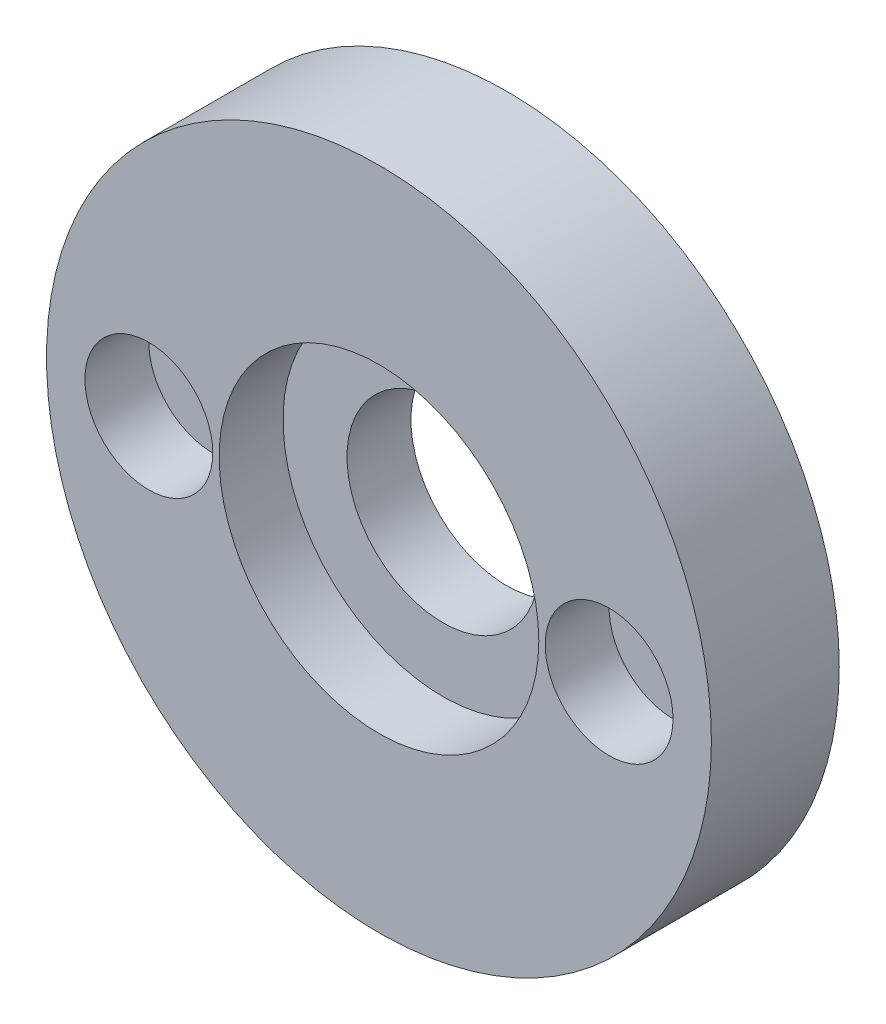
ISO-10303-21;
HEADER;
FILE_DESCRIPTION(('STEP AP214'),'2;1');
FILE_NAME('part.step','',(''),(''),'','','');
FILE_SCHEMA(('AUTOMOTIVE_DESIGN { 1 0 10303 214 1 1 1 1 }'));
ENDSEC;
DATA;
#1=APPLICATION_CONTEXT('core data for automotive mechanical design processes');
#2=APPLICATION_PROTOCOL_DEFINITION('international standard','automotive_design',2000,#1);
#3=PRODUCT_CONTEXT('',#1,'mechanical');
#4=PRODUCT('Part','Part','',(#3));
#5=PRODUCT_RELATED_PRODUCT_CATEGORY('part','',(#4));
#6=PRODUCT_DEFINITION_FORMATION('','',#4);
#7=PRODUCT_DEFINITION_CONTEXT('part definition',#1,'design');
#8=PRODUCT_DEFINITION('design','',#6,#7);
#9=PRODUCT_DEFINITION_SHAPE('','',#8);
#10=(LENGTH_UNIT() NAMED_UNIT(*) SI_UNIT(.MILLI.,.METRE.));
#11=(NAMED_UNIT(*) PLANE_ANGLE_UNIT() SI_UNIT($,.RADIAN.));
#12=(NAMED_UNIT(*) SI_UNIT($,.STERADIAN.) SOLID_ANGLE_UNIT());
#13=UNCERTAINTY_MEASURE_WITH_UNIT(LENGTH_MEASURE(1.E-05),#10,'distance_accuracy_value','');
#14=(GEOMETRIC_REPRESENTATION_CONTEXT(3) GLOBAL_UNCERTAINTY_ASSIGNED_CONTEXT((#13)) GLOBAL_UNIT_ASSIGNED_CONTEXT((#10,
#11,#12)) REPRESENTATION_CONTEXT('',''));
#15=CARTESIAN_POINT('',(0.,0.,0.));
#16=DIRECTION('',(0.,0.,1.));
#17=DIRECTION('',(1.,0.,0.));
#18=AXIS2_PLACEMENT_3D('',#15,#16,#17);
#19=CARTESIAN_POINT('',(0.,0.,10.));
#20=DIRECTION('',(0.,0.,-1.));
#21=DIRECTION('',(-1.,0.,0.));
#22=AXIS2_PLACEMENT_3D('',#19,#20,#21);
#23=CYLINDRICAL_SURFACE('',#22,7.5);
#24=CARTESIAN_POINT('',(0.,0.,0.));
#25=DIRECTION('',(0.,0.,1.));
#26=DIRECTION('',(1.,0.,0.));
#27=AXIS2_PLACEMENT_3D('',#24,#25,#26);
#28=CIRCLE('',#27,7.5);
#29=CARTESIAN_POINT('',(7.5,0.,0.));
#30=VERTEX_POINT('',#29);
#31=EDGE_CURVE('E47',#30,#30,#28,.T.);
#32=ORIENTED_EDGE('',*,*,#31,.F.);
#33=EDGE_LOOP('',(#32));
#34=FACE_BOUND('',#33,.T.);
#35=CARTESIAN_POINT('',(0.,0.,5.));
#36=DIRECTION('',(0.,0.,1.));
#37=DIRECTION('',(1.,0.,0.));
#38=AXIS2_PLACEMENT_3D('',#35,#36,#37);
#39=CIRCLE('',#38,7.5);
#40=CARTESIAN_POINT('',(7.5,0.,5.));
#41=VERTEX_POINT('',#40);
#42=EDGE_CURVE('E36',#41,#41,#39,.T.);
#43=ORIENTED_EDGE('',*,*,#42,.T.);
#44=EDGE_LOOP('',(#43));
#45=FACE_BOUND('',#44,.T.);
#46=ADVANCED_FACE('F32',(#34,#45),#23,.F.);
#47=CARTESIAN_POINT('',(-18.,0.,10.));
#48=DIRECTION('',(0.,0.,-1.));
#49=DIRECTION('',(-1.,0.,0.));
#50=AXIS2_PLACEMENT_3D('',#47,#48,#49);
#51=CYLINDRICAL_SURFACE('',#50,5.);
#52=CARTESIAN_POINT('',(-18.,0.,5.));
#53=DIRECTION('',(0.,0.,1.));
#54=DIRECTION('',(1.,0.,0.));
#55=AXIS2_PLACEMENT_3D('',#52,#53,#54);
#56=CIRCLE('',#55,5.);
#57=CARTESIAN_POINT('',(-13.,0.,5.));
#58=VERTEX_POINT('',#57);
#59=EDGE_CURVE('E10',#58,#58,#56,.T.);
#60=ORIENTED_EDGE('',*,*,#59,.F.);
#61=EDGE_LOOP('',(#60));
#62=FACE_BOUND('',#61,.T.);
#63=CARTESIAN_POINT('',(-18.,0.,10.));
#64=DIRECTION('',(0.,0.,1.));
#65=DIRECTION('',(1.,0.,0.));
#66=AXIS2_PLACEMENT_3D('',#63,#64,#65);
#67=CIRCLE('',#66,5.);
#68=CARTESIAN_POINT('',(-13.,0.,10.));
#69=VERTEX_POINT('',#68);
#70=EDGE_CURVE('E44',#69,#69,#67,.T.);
#71=ORIENTED_EDGE('',*,*,#70,.T.);
#72=EDGE_LOOP('',(#71));
#73=FACE_BOUND('',#72,.T.);
#74=ADVANCED_FACE('F95',(#62,#73),#51,.F.);
#75=CARTESIAN_POINT('',(0.,0.,10.));
#76=DIRECTION('',(0.,0.,-1.));
#77=DIRECTION('',(-1.,0.,0.));
#78=AXIS2_PLACEMENT_3D('',#75,#76,#77);
#79=CYLINDRICAL_SURFACE('',#78,26.);
#80=CARTESIAN_POINT('',(0.,0.,10.));
#81=DIRECTION('',(0.,0.,1.));
#82=DIRECTION('',(1.,0.,0.));
#83=AXIS2_PLACEMENT_3D('',#80,#81,#82);
#84=CIRCLE('',#83,26.);
#85=CARTESIAN_POINT('',(26.,0.,10.));
#86=VERTEX_POINT('',#85);
#87=EDGE_CURVE('E50',#86,#86,#84,.T.);
#88=ORIENTED_EDGE('',*,*,#87,.F.);
#89=EDGE_LOOP('',(#88));
#90=FACE_BOUND('',#89,.T.);
#91=CARTESIAN_POINT('',(0.,0.,0.));
#92=DIRECTION('',(0.,0.,1.));
#93=DIRECTION('',(1.,0.,0.));
#94=AXIS2_PLACEMENT_3D('',#91,#92,#93);
#95=CIRCLE('',#94,26.);
#96=CARTESIAN_POINT('',(26.,0.,0.));
#97=VERTEX_POINT('',#96);
#98=EDGE_CURVE('E51',#97,#97,#95,.T.);
#99=ORIENTED_EDGE('',*,*,#98,.T.);
#100=EDGE_LOOP('',(#99));
#101=FACE_BOUND('',#100,.T.);
#102=ADVANCED_FACE('F34',(#90,#101),#79,.T.);
#103=CARTESIAN_POINT('',(18.,0.,10.));
#104=DIRECTION('',(0.,0.,-1.));
#105=DIRECTION('',(-1.,0.,0.));
#106=AXIS2_PLACEMENT_3D('',#103,#104,#105);
#107=CYLINDRICAL_SURFACE('',#106,5.);
#108=CARTESIAN_POINT('',(18.,0.,5.));
#109=DIRECTION('',(0.,0.,1.));
#110=DIRECTION('',(1.,0.,0.));
#111=AXIS2_PLACEMENT_3D('',#108,#109,#110);
#112=CIRCLE('',#111,5.);
#113=CARTESIAN_POINT('',(23.,0.,5.));
#114=VERTEX_POINT('',#113);
#115=EDGE_CURVE('E68',#114,#114,#112,.F.);
#116=ORIENTED_EDGE('',*,*,#115,.T.);
#117=EDGE_LOOP('',(#116));
#118=FACE_BOUND('',#117,.T.);
#119=CARTESIAN_POINT('',(18.,0.,10.));
#120=DIRECTION('',(0.,0.,1.));
#121=DIRECTION('',(1.,0.,0.));
#122=AXIS2_PLACEMENT_3D('',#119,#120,#121);
#123=CIRCLE('',#122,5.);
#124=CARTESIAN_POINT('',(23.,0.,10.));
#125=VERTEX_POINT('',#124);
#126=EDGE_CURVE('E40',#125,#125,#123,.F.);
#127=ORIENTED_EDGE('',*,*,#126,.F.);
#128=EDGE_LOOP('',(#127));
#129=FACE_BOUND('',#128,.T.);
#130=ADVANCED_FACE('F104',(#118,#129),#107,.F.);
#131=CARTESIAN_POINT('',(0.,0.,10.));
#132=DIRECTION('',(0.,0.,1.));
#133=DIRECTION('',(1.,0.,0.));
#134=AXIS2_PLACEMENT_3D('',#131,#132,#133);
#135=PLANE('',#134);
#136=CARTESIAN_POINT('',(0.,0.,10.));
#137=DIRECTION('',(0.,0.,1.));
#138=DIRECTION('',(1.,0.,0.));
#139=AXIS2_PLACEMENT_3D('',#136,#137,#138);
#140=CIRCLE('',#139,12.5);
#141=CARTESIAN_POINT('',(12.5,0.,10.));
#142=VERTEX_POINT('',#141);
#143=EDGE_CURVE('E73',#142,#142,#140,.T.);
#144=ORIENTED_EDGE('',*,*,#143,.F.);
#145=EDGE_LOOP('',(#144));
#146=FACE_BOUND('',#145,.T.);
#147=ORIENTED_EDGE('',*,*,#87,.T.);
#148=EDGE_LOOP('',(#147));
#149=FACE_BOUND('',#148,.T.);
#150=ORIENTED_EDGE('',*,*,#70,.F.);
#151=EDGE_LOOP('',(#150));
#152=FACE_BOUND('',#151,.T.);
#153=ORIENTED_EDGE('',*,*,#126,.T.);
#154=EDGE_LOOP('',(#153));
#155=FACE_BOUND('',#154,.T.);
#156=ADVANCED_FACE('F107',(#146,#149,#152,#155),#135,.T.);
#157=CARTESIAN_POINT('',(0.,0.,0.));
#158=DIRECTION('',(0.,0.,1.));
#159=DIRECTION('',(1.,0.,0.));
#160=AXIS2_PLACEMENT_3D('',#157,#158,#159);
#161=PLANE('',#160);
#162=ORIENTED_EDGE('',*,*,#98,.F.);
#163=EDGE_LOOP('',(#162));
#164=FACE_BOUND('',#163,.T.);
#165=ORIENTED_EDGE('',*,*,#31,.T.);
#166=EDGE_LOOP('',(#165));
#167=FACE_BOUND('',#166,.T.);
#168=CARTESIAN_POINT('',(-18.,0.,0.));
#169=DIRECTION('',(0.,0.,1.));
#170=DIRECTION('',(1.,0.,0.));
#171=AXIS2_PLACEMENT_3D('',#168,#169,#170);
#172=CIRCLE('',#171,2.00000000000001);
#173=CARTESIAN_POINT('',(-16.,0.,0.));
#174=VERTEX_POINT('',#173);
#175=EDGE_CURVE('E59',#174,#174,#172,.T.);
#176=ORIENTED_EDGE('',*,*,#175,.T.);
#177=EDGE_LOOP('',(#176));
#178=FACE_BOUND('',#177,.T.);
#179=CARTESIAN_POINT('',(18.,0.,0.));
#180=DIRECTION('',(0.,0.,1.));
#181=DIRECTION('',(1.,0.,0.));
#182=AXIS2_PLACEMENT_3D('',#179,#180,#181);
#183=CIRCLE('',#182,2.00000000000001);
#184=CARTESIAN_POINT('',(20.,0.,0.));
#185=VERTEX_POINT('',#184);
#186=EDGE_CURVE('E65',#185,#185,#183,.F.);
#187=ORIENTED_EDGE('',*,*,#186,.F.);
#188=EDGE_LOOP('',(#187));
#189=FACE_BOUND('',#188,.T.);
#190=ADVANCED_FACE('F109',(#164,#167,#178,#189),#161,.F.);
#191=CARTESIAN_POINT('',(-18.,0.,5.));
#192=DIRECTION('',(0.,0.,-1.));
#193=DIRECTION('',(-1.,0.,0.));
#194=AXIS2_PLACEMENT_3D('',#191,#192,#193);
#195=CYLINDRICAL_SURFACE('',#194,2.00000000000001);
#196=CARTESIAN_POINT('',(-18.,0.,5.));
#197=DIRECTION('',(0.,0.,1.));
#198=DIRECTION('',(1.,0.,0.));
#199=AXIS2_PLACEMENT_3D('',#196,#197,#198);
#200=CIRCLE('',#199,2.00000000000001);
#201=CARTESIAN_POINT('',(-16.,0.,5.));
#202=VERTEX_POINT('',#201);
#203=EDGE_CURVE('E53',#202,#202,#200,.T.);
#204=ORIENTED_EDGE('',*,*,#203,.T.);
#205=EDGE_LOOP('',(#204));
#206=FACE_BOUND('',#205,.T.);
#207=ORIENTED_EDGE('',*,*,#175,.F.);
#208=EDGE_LOOP('',(#207));
#209=FACE_BOUND('',#208,.T.);
#210=ADVANCED_FACE('F112',(#206,#209),#195,.F.);
#211=CARTESIAN_POINT('',(0.,0.,5.));
#212=DIRECTION('',(0.,0.,1.));
#213=DIRECTION('',(1.,0.,0.));
#214=AXIS2_PLACEMENT_3D('',#211,#212,#213);
#215=PLANE('',#214);
#216=ORIENTED_EDGE('',*,*,#203,.F.);
#217=EDGE_LOOP('',(#216));
#218=FACE_BOUND('',#217,.T.);
#219=ORIENTED_EDGE('',*,*,#59,.T.);
#220=EDGE_LOOP('',(#219));
#221=FACE_BOUND('',#220,.T.);
#222=ADVANCED_FACE('F119',(#218,#221),#215,.T.);
#223=CARTESIAN_POINT('',(18.,0.,5.));
#224=DIRECTION('',(0.,0.,-1.));
#225=DIRECTION('',(-1.,0.,0.));
#226=AXIS2_PLACEMENT_3D('',#223,#224,#225);
#227=CYLINDRICAL_SURFACE('',#226,2.00000000000001);
#228=CARTESIAN_POINT('',(18.,0.,5.));
#229=DIRECTION('',(0.,0.,1.));
#230=DIRECTION('',(1.,0.,0.));
#231=AXIS2_PLACEMENT_3D('',#228,#229,#230);
#232=CIRCLE('',#231,2.00000000000001);
#233=CARTESIAN_POINT('',(20.,0.,5.));
#234=VERTEX_POINT('',#233);
#235=EDGE_CURVE('E62',#234,#234,#232,.F.);
#236=ORIENTED_EDGE('',*,*,#235,.F.);
#237=EDGE_LOOP('',(#236));
#238=FACE_BOUND('',#237,.T.);
#239=ORIENTED_EDGE('',*,*,#186,.T.);
#240=EDGE_LOOP('',(#239));
#241=FACE_BOUND('',#240,.T.);
#242=ADVANCED_FACE('F123',(#238,#241),#227,.F.);
#243=CARTESIAN_POINT('',(0.,0.,5.));
#244=DIRECTION('',(0.,0.,1.));
#245=DIRECTION('',(1.,0.,0.));
#246=AXIS2_PLACEMENT_3D('',#243,#244,#245);
#247=PLANE('',#246);
#248=ORIENTED_EDGE('',*,*,#115,.F.);
#249=EDGE_LOOP('',(#248));
#250=FACE_BOUND('',#249,.T.);
#251=ORIENTED_EDGE('',*,*,#235,.T.);
#252=EDGE_LOOP('',(#251));
#253=FACE_BOUND('',#252,.T.);
#254=ADVANCED_FACE('F91',(#250,#253),#247,.T.);
#255=CARTESIAN_POINT('',(0.,0.,5.));
#256=DIRECTION('',(0.,0.,1.));
#257=DIRECTION('',(1.,0.,0.));
#258=AXIS2_PLACEMENT_3D('',#255,#256,#257);
#259=CYLINDRICAL_SURFACE('',#258,12.5);
#260=CARTESIAN_POINT('',(0.,0.,5.));
#261=DIRECTION('',(0.,0.,1.));
#262=DIRECTION('',(1.,0.,0.));
#263=AXIS2_PLACEMENT_3D('',#260,#261,#262);
#264=CIRCLE('',#263,12.5);
#265=CARTESIAN_POINT('',(12.5,0.,5.));
#266=VERTEX_POINT('',#265);
#267=EDGE_CURVE('E76',#266,#266,#264,.T.);
#268=ORIENTED_EDGE('',*,*,#267,.F.);
#269=EDGE_LOOP('',(#268));
#270=FACE_BOUND('',#269,.T.);
#271=ORIENTED_EDGE('',*,*,#143,.T.);
#272=EDGE_LOOP('',(#271));
#273=FACE_BOUND('',#272,.T.);
#274=ADVANCED_FACE('F86',(#270,#273),#259,.F.);
#275=CARTESIAN_POINT('',(0.,0.,5.));
#276=DIRECTION('',(0.,0.,1.));
#277=DIRECTION('',(1.,0.,0.));
#278=AXIS2_PLACEMENT_3D('',#275,#276,#277);
#279=PLANE('',#278);
#280=ORIENTED_EDGE('',*,*,#42,.F.);
#281=EDGE_LOOP('',(#280));
#282=FACE_BOUND('',#281,.T.);
#283=ORIENTED_EDGE('',*,*,#267,.T.);
#284=EDGE_LOOP('',(#283));
#285=FACE_BOUND('',#284,.T.);
#286=ADVANCED_FACE('F84',(#282,#285),#279,.T.);
#287=CLOSED_SHELL('',(#46,#74,#102,#130,#156,#190,#210,#222,#242,#254,#274,#286));
#288=MANIFOLD_SOLID_BREP('B2',#287);
#289=ADVANCED_BREP_SHAPE_REPRESENTATION('',(#18,#288),#14);
#290=SHAPE_DEFINITION_REPRESENTATION(#9,#289);
ENDSEC;
END-ISO-10303-21;
